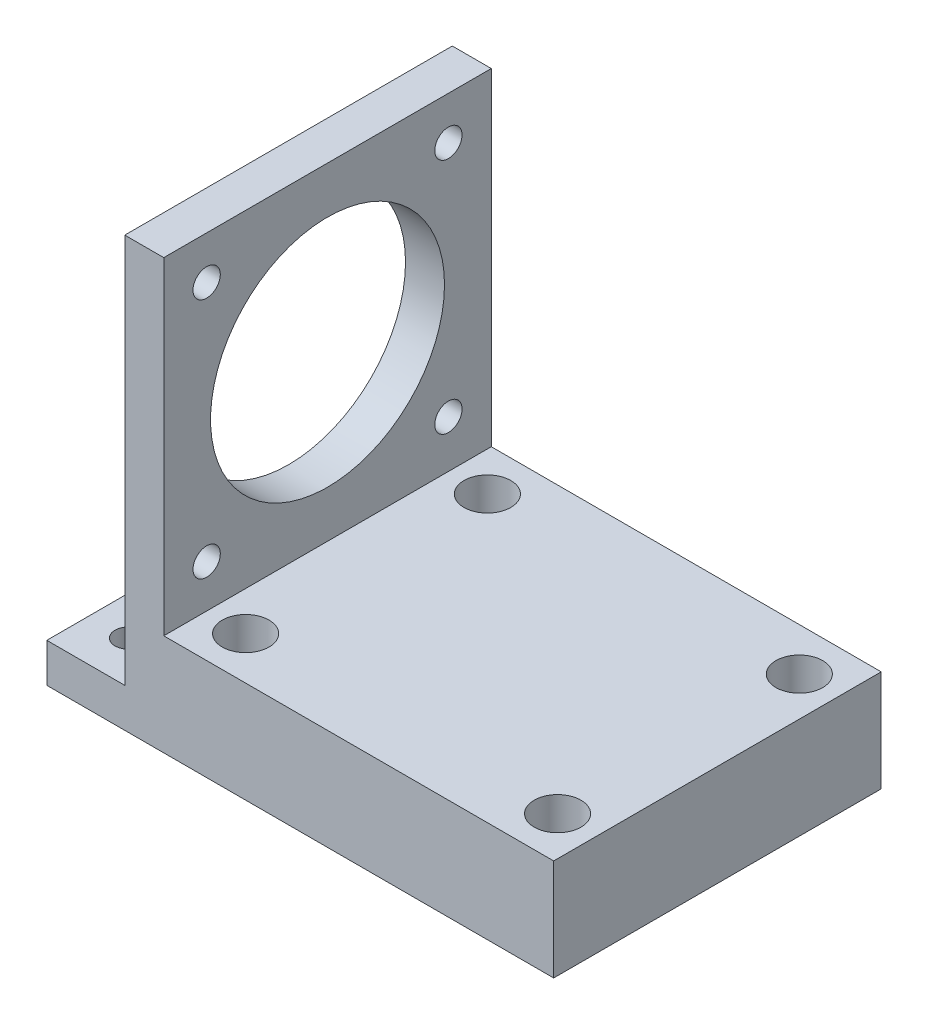
ISO-10303-21;
HEADER;
FILE_DESCRIPTION(('STEP AP214'),'2;1');
FILE_NAME('part.step','',(''),(''),'','','');
FILE_SCHEMA(('AUTOMOTIVE_DESIGN { 1 0 10303 214 1 1 1 1 }'));
ENDSEC;
DATA;
#1=APPLICATION_CONTEXT('core data for automotive mechanical design processes');
#2=APPLICATION_PROTOCOL_DEFINITION('international standard','automotive_design',2000,#1);
#3=PRODUCT_CONTEXT('',#1,'mechanical');
#4=PRODUCT('Part','Part','',(#3));
#5=PRODUCT_RELATED_PRODUCT_CATEGORY('part','',(#4));
#6=PRODUCT_DEFINITION_FORMATION('','',#4);
#7=PRODUCT_DEFINITION_CONTEXT('part definition',#1,'design');
#8=PRODUCT_DEFINITION('design','',#6,#7);
#9=PRODUCT_DEFINITION_SHAPE('','',#8);
#10=(LENGTH_UNIT() NAMED_UNIT(*) SI_UNIT(.MILLI.,.METRE.));
#11=(NAMED_UNIT(*) PLANE_ANGLE_UNIT() SI_UNIT($,.RADIAN.));
#12=(NAMED_UNIT(*) SI_UNIT($,.STERADIAN.) SOLID_ANGLE_UNIT());
#13=UNCERTAINTY_MEASURE_WITH_UNIT(LENGTH_MEASURE(1.E-05),#10,'distance_accuracy_value','');
#14=(GEOMETRIC_REPRESENTATION_CONTEXT(3) GLOBAL_UNCERTAINTY_ASSIGNED_CONTEXT((#13)) GLOBAL_UNIT_ASSIGNED_CONTEXT((#10,
#11,#12)) REPRESENTATION_CONTEXT('',''));
#15=CARTESIAN_POINT('',(0.,0.,0.));
#16=DIRECTION('',(0.,0.,1.));
#17=DIRECTION('',(1.,0.,0.));
#18=AXIS2_PLACEMENT_3D('',#15,#16,#17);
#19=CARTESIAN_POINT('',(-12.5,0.,-15.5));
#20=DIRECTION('',(0.,1.,0.));
#21=DIRECTION('',(0.,0.,1.));
#22=AXIS2_PLACEMENT_3D('',#19,#20,#21);
#23=CYLINDRICAL_SURFACE('',#22,1.75);
#24=CARTESIAN_POINT('',(-12.5,0.,-15.5));
#25=DIRECTION('',(0.,1.,0.));
#26=DIRECTION('',(0.,0.,1.));
#27=AXIS2_PLACEMENT_3D('',#24,#25,#26);
#28=CIRCLE('',#27,1.75);
#29=CARTESIAN_POINT('',(-12.5,0.,-13.75));
#30=VERTEX_POINT('',#29);
#31=EDGE_CURVE('E190',#30,#30,#28,.T.);
#32=ORIENTED_EDGE('',*,*,#31,.F.);
#33=EDGE_LOOP('',(#32));
#34=FACE_BOUND('',#33,.T.);
#35=CARTESIAN_POINT('',(-12.5,5.,-15.5));
#36=DIRECTION('',(0.,1.,0.));
#37=DIRECTION('',(0.,0.,1.));
#38=AXIS2_PLACEMENT_3D('',#35,#36,#37);
#39=CIRCLE('',#38,1.75);
#40=CARTESIAN_POINT('',(-12.5,5.,-13.75));
#41=VERTEX_POINT('',#40);
#42=EDGE_CURVE('E42',#41,#41,#39,.F.);
#43=ORIENTED_EDGE('',*,*,#42,.F.);
#44=EDGE_LOOP('',(#43));
#45=FACE_BOUND('',#44,.T.);
#46=ADVANCED_FACE('F38',(#34,#45),#23,.F.);
#47=CARTESIAN_POINT('',(27.5,0.,-15.5));
#48=DIRECTION('',(0.,1.,0.));
#49=DIRECTION('',(0.,0.,1.));
#50=AXIS2_PLACEMENT_3D('',#47,#48,#49);
#51=CYLINDRICAL_SURFACE('',#50,1.75);
#52=CARTESIAN_POINT('',(27.5,0.,-15.5));
#53=DIRECTION('',(0.,1.,0.));
#54=DIRECTION('',(0.,0.,1.));
#55=AXIS2_PLACEMENT_3D('',#52,#53,#54);
#56=CIRCLE('',#55,1.75);
#57=CARTESIAN_POINT('',(27.5,0.,-13.75));
#58=VERTEX_POINT('',#57);
#59=EDGE_CURVE('E186',#58,#58,#56,.T.);
#60=ORIENTED_EDGE('',*,*,#59,.F.);
#61=EDGE_LOOP('',(#60));
#62=FACE_BOUND('',#61,.T.);
#63=CARTESIAN_POINT('',(27.5,5.,-15.5));
#64=DIRECTION('',(0.,1.,0.));
#65=DIRECTION('',(0.,0.,1.));
#66=AXIS2_PLACEMENT_3D('',#63,#64,#65);
#67=CIRCLE('',#66,1.75);
#68=CARTESIAN_POINT('',(27.5,5.,-13.75));
#69=VERTEX_POINT('',#68);
#70=EDGE_CURVE('E168',#69,#69,#67,.F.);
#71=ORIENTED_EDGE('',*,*,#70,.F.);
#72=EDGE_LOOP('',(#71));
#73=FACE_BOUND('',#72,.T.);
#74=ADVANCED_FACE('F303',(#62,#73),#51,.F.);
#75=CARTESIAN_POINT('',(27.5000000000003,0.,15.5));
#76=DIRECTION('',(0.,1.,0.));
#77=DIRECTION('',(0.,0.,1.));
#78=AXIS2_PLACEMENT_3D('',#75,#76,#77);
#79=CYLINDRICAL_SURFACE('',#78,1.75);
#80=CARTESIAN_POINT('',(27.5000000000003,0.,15.5));
#81=DIRECTION('',(0.,1.,0.));
#82=DIRECTION('',(0.,0.,1.));
#83=AXIS2_PLACEMENT_3D('',#80,#81,#82);
#84=CIRCLE('',#83,1.75);
#85=CARTESIAN_POINT('',(27.5000000000003,0.,17.25));
#86=VERTEX_POINT('',#85);
#87=EDGE_CURVE('E180',#86,#86,#84,.T.);
#88=ORIENTED_EDGE('',*,*,#87,.F.);
#89=EDGE_LOOP('',(#88));
#90=FACE_BOUND('',#89,.T.);
#91=CARTESIAN_POINT('',(27.5000000000003,5.,15.5));
#92=DIRECTION('',(0.,1.,0.));
#93=DIRECTION('',(0.,0.,1.));
#94=AXIS2_PLACEMENT_3D('',#91,#92,#93);
#95=CIRCLE('',#94,1.75);
#96=CARTESIAN_POINT('',(27.5000000000003,5.,17.25));
#97=VERTEX_POINT('',#96);
#98=EDGE_CURVE('E164',#97,#97,#95,.F.);
#99=ORIENTED_EDGE('',*,*,#98,.F.);
#100=EDGE_LOOP('',(#99));
#101=FACE_BOUND('',#100,.T.);
#102=ADVANCED_FACE('F310',(#90,#101),#79,.F.);
#103=CARTESIAN_POINT('',(-12.4999999999997,0.,15.5));
#104=DIRECTION('',(0.,1.,0.));
#105=DIRECTION('',(0.,0.,1.));
#106=AXIS2_PLACEMENT_3D('',#103,#104,#105);
#107=CYLINDRICAL_SURFACE('',#106,1.75);
#108=CARTESIAN_POINT('',(-12.4999999999997,0.,15.5));
#109=DIRECTION('',(0.,1.,0.));
#110=DIRECTION('',(0.,0.,1.));
#111=AXIS2_PLACEMENT_3D('',#108,#109,#110);
#112=CIRCLE('',#111,1.75);
#113=CARTESIAN_POINT('',(-12.4999999999997,0.,17.25));
#114=VERTEX_POINT('',#113);
#115=EDGE_CURVE('E175',#114,#114,#112,.T.);
#116=ORIENTED_EDGE('',*,*,#115,.F.);
#117=EDGE_LOOP('',(#116));
#118=FACE_BOUND('',#117,.T.);
#119=CARTESIAN_POINT('',(-12.4999999999997,5.,15.5));
#120=DIRECTION('',(0.,1.,0.));
#121=DIRECTION('',(0.,0.,1.));
#122=AXIS2_PLACEMENT_3D('',#119,#120,#121);
#123=CIRCLE('',#122,1.75);
#124=CARTESIAN_POINT('',(-12.4999999999997,5.,17.25));
#125=VERTEX_POINT('',#124);
#126=EDGE_CURVE('E160',#125,#125,#123,.F.);
#127=ORIENTED_EDGE('',*,*,#126,.F.);
#128=EDGE_LOOP('',(#127));
#129=FACE_BOUND('',#128,.T.);
#130=ADVANCED_FACE('F317',(#118,#129),#107,.F.);
#131=CARTESIAN_POINT('',(0.,55.,0.));
#132=DIRECTION('',(0.,-1.,0.));
#133=DIRECTION('',(0.,0.,-1.));
#134=AXIS2_PLACEMENT_3D('',#131,#132,#133);
#135=PLANE('',#134);
#136=DIRECTION('',(0.,0.,1.));
#137=VECTOR('',#136,1.);
#138=CARTESIAN_POINT('',(-17.5,55.,21.));
#139=LINE('',#138,#137);
#140=CARTESIAN_POINT('',(-17.5,55.,-21.));
#141=VERTEX_POINT('',#140);
#142=CARTESIAN_POINT('',(-17.5,55.,21.));
#143=VERTEX_POINT('',#142);
#144=EDGE_CURVE('E108',#141,#143,#139,.T.);
#145=ORIENTED_EDGE('',*,*,#144,.F.);
#146=DIRECTION('',(-1.,0.,0.));
#147=VECTOR('',#146,1.);
#148=CARTESIAN_POINT('',(32.5,55.,-21.));
#149=LINE('',#148,#147);
#150=CARTESIAN_POINT('',(-22.5,55.,-21.));
#151=VERTEX_POINT('',#150);
#152=EDGE_CURVE('E119',#141,#151,#149,.T.);
#153=ORIENTED_EDGE('',*,*,#152,.T.);
#154=DIRECTION('',(0.,0.,-1.));
#155=VECTOR('',#154,1.);
#156=CARTESIAN_POINT('',(-22.5,55.,-21.));
#157=LINE('',#156,#155);
#158=CARTESIAN_POINT('',(-22.5,55.,21.));
#159=VERTEX_POINT('',#158);
#160=EDGE_CURVE('E257',#159,#151,#157,.T.);
#161=ORIENTED_EDGE('',*,*,#160,.F.);
#162=DIRECTION('',(1.,0.,0.));
#163=VECTOR('',#162,1.);
#164=CARTESIAN_POINT('',(32.5,55.,21.));
#165=LINE('',#164,#163);
#166=EDGE_CURVE('E121',#159,#143,#165,.T.);
#167=ORIENTED_EDGE('',*,*,#166,.T.);
#168=EDGE_LOOP('',(#145,#153,#161,#167));
#169=FACE_BOUND('',#168,.T.);
#170=ADVANCED_FACE('F118',(#169),#135,.F.);
#171=CARTESIAN_POINT('',(-32.5,55.,-21.));
#172=DIRECTION('',(1.,0.,0.));
#173=DIRECTION('',(0.,0.,-1.));
#174=AXIS2_PLACEMENT_3D('',#171,#172,#173);
#175=PLANE('',#174);
#176=DIRECTION('',(0.,-1.,0.));
#177=VECTOR('',#176,1.);
#178=CARTESIAN_POINT('',(-32.5,55.,21.));
#179=LINE('',#178,#177);
#180=CARTESIAN_POINT('',(-32.5,5.,21.));
#181=VERTEX_POINT('',#180);
#182=CARTESIAN_POINT('',(-32.5,0.,21.));
#183=VERTEX_POINT('',#182);
#184=EDGE_CURVE('E11',#181,#183,#179,.T.);
#185=ORIENTED_EDGE('',*,*,#184,.F.);
#186=DIRECTION('',(0.,0.,1.));
#187=VECTOR('',#186,1.);
#188=CARTESIAN_POINT('',(-32.5,5.,-21.));
#189=LINE('',#188,#187);
#190=CARTESIAN_POINT('',(-32.5,5.,-21.));
#191=VERTEX_POINT('',#190);
#192=EDGE_CURVE('E252',#191,#181,#189,.T.);
#193=ORIENTED_EDGE('',*,*,#192,.F.);
#194=DIRECTION('',(0.,-1.,0.));
#195=VECTOR('',#194,1.);
#196=CARTESIAN_POINT('',(-32.5,55.,-21.));
#197=LINE('',#196,#195);
#198=CARTESIAN_POINT('',(-32.5,0.,-21.));
#199=VERTEX_POINT('',#198);
#200=EDGE_CURVE('E130',#191,#199,#197,.T.);
#201=ORIENTED_EDGE('',*,*,#200,.T.);
#202=DIRECTION('',(0.,0.,1.));
#203=VECTOR('',#202,1.);
#204=CARTESIAN_POINT('',(-32.5,0.,-21.));
#205=LINE('',#204,#203);
#206=EDGE_CURVE('E140',#199,#183,#205,.T.);
#207=ORIENTED_EDGE('',*,*,#206,.T.);
#208=EDGE_LOOP('',(#185,#193,#201,#207));
#209=FACE_BOUND('',#208,.T.);
#210=ADVANCED_FACE('F40',(#209),#175,.F.);
#211=CARTESIAN_POINT('',(32.5,55.,21.));
#212=DIRECTION('',(0.,0.,-1.));
#213=DIRECTION('',(-1.,0.,0.));
#214=AXIS2_PLACEMENT_3D('',#211,#212,#213);
#215=PLANE('',#214);
#216=DIRECTION('',(0.,-1.,0.));
#217=VECTOR('',#216,1.);
#218=CARTESIAN_POINT('',(32.5,55.,21.));
#219=LINE('',#218,#217);
#220=CARTESIAN_POINT('',(32.5,13.,21.));
#221=VERTEX_POINT('',#220);
#222=CARTESIAN_POINT('',(32.5,0.,21.));
#223=VERTEX_POINT('',#222);
#224=EDGE_CURVE('E48',#221,#223,#219,.T.);
#225=ORIENTED_EDGE('',*,*,#224,.F.);
#226=DIRECTION('',(1.,0.,0.));
#227=VECTOR('',#226,1.);
#228=CARTESIAN_POINT('',(-17.5,13.,21.));
#229=LINE('',#228,#227);
#230=CARTESIAN_POINT('',(-17.5,13.,21.));
#231=VERTEX_POINT('',#230);
#232=EDGE_CURVE('E246',#231,#221,#229,.T.);
#233=ORIENTED_EDGE('',*,*,#232,.F.);
#234=DIRECTION('',(0.,-1.,0.));
#235=VECTOR('',#234,1.);
#236=CARTESIAN_POINT('',(-17.5,55.,21.));
#237=LINE('',#236,#235);
#238=EDGE_CURVE('E123',#143,#231,#237,.T.);
#239=ORIENTED_EDGE('',*,*,#238,.F.);
#240=ORIENTED_EDGE('',*,*,#166,.F.);
#241=DIRECTION('',(0.,1.,0.));
#242=VECTOR('',#241,1.);
#243=CARTESIAN_POINT('',(-22.5,55.,21.));
#244=LINE('',#243,#242);
#245=CARTESIAN_POINT('',(-22.5,5.,21.));
#246=VERTEX_POINT('',#245);
#247=EDGE_CURVE('E64',#246,#159,#244,.T.);
#248=ORIENTED_EDGE('',*,*,#247,.F.);
#249=DIRECTION('',(-1.,0.,0.));
#250=VECTOR('',#249,1.);
#251=CARTESIAN_POINT('',(-22.5,5.,21.));
#252=LINE('',#251,#250);
#253=EDGE_CURVE('E145',#246,#181,#252,.T.);
#254=ORIENTED_EDGE('',*,*,#253,.T.);
#255=ORIENTED_EDGE('',*,*,#184,.T.);
#256=DIRECTION('',(1.,0.,0.));
#257=VECTOR('',#256,1.);
#258=CARTESIAN_POINT('',(32.5,0.,21.));
#259=LINE('',#258,#257);
#260=EDGE_CURVE('E144',#183,#223,#259,.T.);
#261=ORIENTED_EDGE('',*,*,#260,.T.);
#262=EDGE_LOOP('',(#225,#233,#239,#240,#248,#254,#255,#261));
#263=FACE_BOUND('',#262,.T.);
#264=ADVANCED_FACE('F287',(#263),#215,.F.);
#265=CARTESIAN_POINT('',(32.5,55.,-21.));
#266=DIRECTION('',(-1.,0.,0.));
#267=DIRECTION('',(0.,0.,1.));
#268=AXIS2_PLACEMENT_3D('',#265,#266,#267);
#269=PLANE('',#268);
#270=DIRECTION('',(0.,-1.,0.));
#271=VECTOR('',#270,1.);
#272=CARTESIAN_POINT('',(32.5,55.,-21.));
#273=LINE('',#272,#271);
#274=CARTESIAN_POINT('',(32.5,13.,-21.));
#275=VERTEX_POINT('',#274);
#276=CARTESIAN_POINT('',(32.5,0.,-21.));
#277=VERTEX_POINT('',#276);
#278=EDGE_CURVE('E134',#275,#277,#273,.T.);
#279=ORIENTED_EDGE('',*,*,#278,.F.);
#280=DIRECTION('',(0.,0.,-1.));
#281=VECTOR('',#280,1.);
#282=CARTESIAN_POINT('',(32.5,13.,21.));
#283=LINE('',#282,#281);
#284=EDGE_CURVE('E114',#221,#275,#283,.T.);
#285=ORIENTED_EDGE('',*,*,#284,.F.);
#286=ORIENTED_EDGE('',*,*,#224,.T.);
#287=DIRECTION('',(0.,0.,-1.));
#288=VECTOR('',#287,1.);
#289=CARTESIAN_POINT('',(32.5,0.,-21.));
#290=LINE('',#289,#288);
#291=EDGE_CURVE('E149',#223,#277,#290,.T.);
#292=ORIENTED_EDGE('',*,*,#291,.T.);
#293=EDGE_LOOP('',(#279,#285,#286,#292));
#294=FACE_BOUND('',#293,.T.);
#295=ADVANCED_FACE('F294',(#294),#269,.F.);
#296=CARTESIAN_POINT('',(32.5,55.,-21.));
#297=DIRECTION('',(0.,0.,1.));
#298=DIRECTION('',(1.,0.,0.));
#299=AXIS2_PLACEMENT_3D('',#296,#297,#298);
#300=PLANE('',#299);
#301=DIRECTION('',(0.,1.,0.));
#302=VECTOR('',#301,1.);
#303=CARTESIAN_POINT('',(-17.5,55.,-21.));
#304=LINE('',#303,#302);
#305=CARTESIAN_POINT('',(-17.5,13.,-21.));
#306=VERTEX_POINT('',#305);
#307=EDGE_CURVE('E105',#306,#141,#304,.T.);
#308=ORIENTED_EDGE('',*,*,#307,.F.);
#309=DIRECTION('',(1.,0.,0.));
#310=VECTOR('',#309,1.);
#311=CARTESIAN_POINT('',(-17.5,13.,-21.));
#312=LINE('',#311,#310);
#313=EDGE_CURVE('E249',#306,#275,#312,.T.);
#314=ORIENTED_EDGE('',*,*,#313,.T.);
#315=ORIENTED_EDGE('',*,*,#278,.T.);
#316=DIRECTION('',(-1.,0.,0.));
#317=VECTOR('',#316,1.);
#318=CARTESIAN_POINT('',(32.5,0.,-21.));
#319=LINE('',#318,#317);
#320=EDGE_CURVE('E136',#277,#199,#319,.T.);
#321=ORIENTED_EDGE('',*,*,#320,.T.);
#322=ORIENTED_EDGE('',*,*,#200,.F.);
#323=DIRECTION('',(-1.,0.,0.));
#324=VECTOR('',#323,1.);
#325=CARTESIAN_POINT('',(-22.5,5.,-21.));
#326=LINE('',#325,#324);
#327=CARTESIAN_POINT('',(-22.5,5.,-21.));
#328=VERTEX_POINT('',#327);
#329=EDGE_CURVE('E265',#328,#191,#326,.T.);
#330=ORIENTED_EDGE('',*,*,#329,.F.);
#331=DIRECTION('',(0.,-1.,0.));
#332=VECTOR('',#331,1.);
#333=CARTESIAN_POINT('',(-22.5,55.,-21.));
#334=LINE('',#333,#332);
#335=EDGE_CURVE('E128',#151,#328,#334,.T.);
#336=ORIENTED_EDGE('',*,*,#335,.F.);
#337=ORIENTED_EDGE('',*,*,#152,.F.);
#338=EDGE_LOOP('',(#308,#314,#315,#321,#322,#330,#336,#337));
#339=FACE_BOUND('',#338,.T.);
#340=ADVANCED_FACE('F126',(#339),#300,.F.);
#341=CARTESIAN_POINT('',(0.,0.,0.));
#342=DIRECTION('',(0.,-1.,0.));
#343=DIRECTION('',(0.,0.,-1.));
#344=AXIS2_PLACEMENT_3D('',#341,#342,#343);
#345=PLANE('',#344);
#346=ORIENTED_EDGE('',*,*,#115,.T.);
#347=EDGE_LOOP('',(#346));
#348=FACE_BOUND('',#347,.T.);
#349=ORIENTED_EDGE('',*,*,#87,.T.);
#350=EDGE_LOOP('',(#349));
#351=FACE_BOUND('',#350,.T.);
#352=ORIENTED_EDGE('',*,*,#59,.T.);
#353=EDGE_LOOP('',(#352));
#354=FACE_BOUND('',#353,.T.);
#355=ORIENTED_EDGE('',*,*,#31,.T.);
#356=EDGE_LOOP('',(#355));
#357=FACE_BOUND('',#356,.T.);
#358=CARTESIAN_POINT('',(-27.5,0.,-15.5));
#359=DIRECTION('',(0.,1.,0.));
#360=DIRECTION('',(0.,0.,1.));
#361=AXIS2_PLACEMENT_3D('',#358,#359,#360);
#362=CIRCLE('',#361,1.75);
#363=CARTESIAN_POINT('',(-27.5,0.,-13.75));
#364=VERTEX_POINT('',#363);
#365=EDGE_CURVE('E195',#364,#364,#362,.T.);
#366=ORIENTED_EDGE('',*,*,#365,.T.);
#367=EDGE_LOOP('',(#366));
#368=FACE_BOUND('',#367,.T.);
#369=CARTESIAN_POINT('',(-27.5,0.,15.5));
#370=DIRECTION('',(0.,1.,0.));
#371=DIRECTION('',(0.,0.,1.));
#372=AXIS2_PLACEMENT_3D('',#369,#370,#371);
#373=CIRCLE('',#372,1.75);
#374=CARTESIAN_POINT('',(-27.5,0.,17.25));
#375=VERTEX_POINT('',#374);
#376=EDGE_CURVE('E204',#375,#375,#373,.T.);
#377=ORIENTED_EDGE('',*,*,#376,.T.);
#378=EDGE_LOOP('',(#377));
#379=FACE_BOUND('',#378,.T.);
#380=ORIENTED_EDGE('',*,*,#206,.F.);
#381=ORIENTED_EDGE('',*,*,#320,.F.);
#382=ORIENTED_EDGE('',*,*,#291,.F.);
#383=ORIENTED_EDGE('',*,*,#260,.F.);
#384=EDGE_LOOP('',(#380,#381,#382,#383));
#385=FACE_BOUND('',#384,.T.);
#386=ADVANCED_FACE('F284',(#348,#351,#354,#357,#368,#379,#385),#345,.T.);
#387=CARTESIAN_POINT('',(-22.5,5.,-21.));
#388=DIRECTION('',(0.,-1.,0.));
#389=DIRECTION('',(0.,0.,-1.));
#390=AXIS2_PLACEMENT_3D('',#387,#388,#389);
#391=PLANE('',#390);
#392=CARTESIAN_POINT('',(-27.5,5.,-15.5));
#393=DIRECTION('',(0.,1.,0.));
#394=DIRECTION('',(0.,0.,1.));
#395=AXIS2_PLACEMENT_3D('',#392,#393,#394);
#396=CIRCLE('',#395,1.75);
#397=CARTESIAN_POINT('',(-27.5,5.,-13.75));
#398=VERTEX_POINT('',#397);
#399=EDGE_CURVE('E200',#398,#398,#396,.T.);
#400=ORIENTED_EDGE('',*,*,#399,.F.);
#401=EDGE_LOOP('',(#400));
#402=FACE_BOUND('',#401,.T.);
#403=CARTESIAN_POINT('',(-27.5,5.,15.5));
#404=DIRECTION('',(0.,1.,0.));
#405=DIRECTION('',(0.,0.,1.));
#406=AXIS2_PLACEMENT_3D('',#403,#404,#405);
#407=CIRCLE('',#406,1.75);
#408=CARTESIAN_POINT('',(-27.5,5.,17.25));
#409=VERTEX_POINT('',#408);
#410=EDGE_CURVE('E194',#409,#409,#407,.T.);
#411=ORIENTED_EDGE('',*,*,#410,.F.);
#412=EDGE_LOOP('',(#411));
#413=FACE_BOUND('',#412,.T.);
#414=ORIENTED_EDGE('',*,*,#192,.T.);
#415=ORIENTED_EDGE('',*,*,#253,.F.);
#416=DIRECTION('',(0.,0.,1.));
#417=VECTOR('',#416,1.);
#418=CARTESIAN_POINT('',(-22.5,5.,-21.));
#419=LINE('',#418,#417);
#420=EDGE_CURVE('E262',#328,#246,#419,.T.);
#421=ORIENTED_EDGE('',*,*,#420,.F.);
#422=ORIENTED_EDGE('',*,*,#329,.T.);
#423=EDGE_LOOP('',(#414,#415,#421,#422));
#424=FACE_BOUND('',#423,.T.);
#425=ADVANCED_FACE('F274',(#402,#413,#424),#391,.F.);
#426=CARTESIAN_POINT('',(-22.5,0.,0.));
#427=DIRECTION('',(-1.,0.,0.));
#428=DIRECTION('',(0.,0.,1.));
#429=AXIS2_PLACEMENT_3D('',#426,#427,#428);
#430=PLANE('',#429);
#431=CARTESIAN_POINT('',(-22.5,34.,0.));
#432=DIRECTION('',(-1.,0.,0.));
#433=DIRECTION('',(0.,0.,1.));
#434=AXIS2_PLACEMENT_3D('',#431,#432,#433);
#435=CIRCLE('',#434,15.);
#436=CARTESIAN_POINT('',(-22.5,34.,15.));
#437=VERTEX_POINT('',#436);
#438=EDGE_CURVE('E392',#437,#437,#435,.T.);
#439=ORIENTED_EDGE('',*,*,#438,.F.);
#440=EDGE_LOOP('',(#439));
#441=FACE_BOUND('',#440,.T.);
#442=CARTESIAN_POINT('',(-22.5,18.5,15.5));
#443=DIRECTION('',(-1.,0.,0.));
#444=DIRECTION('',(0.,0.,1.));
#445=AXIS2_PLACEMENT_3D('',#442,#443,#444);
#446=CIRCLE('',#445,1.75);
#447=CARTESIAN_POINT('',(-22.5,18.5,17.25));
#448=VERTEX_POINT('',#447);
#449=EDGE_CURVE('E238',#448,#448,#446,.T.);
#450=ORIENTED_EDGE('',*,*,#449,.F.);
#451=EDGE_LOOP('',(#450));
#452=FACE_BOUND('',#451,.T.);
#453=CARTESIAN_POINT('',(-22.5,19.0706640665856,-15.5));
#454=DIRECTION('',(-1.,0.,0.));
#455=DIRECTION('',(0.,0.,1.));
#456=AXIS2_PLACEMENT_3D('',#453,#454,#455);
#457=CIRCLE('',#456,1.75);
#458=CARTESIAN_POINT('',(-22.5,19.0706640665856,-13.75));
#459=VERTEX_POINT('',#458);
#460=EDGE_CURVE('E234',#459,#459,#457,.T.);
#461=ORIENTED_EDGE('',*,*,#460,.F.);
#462=EDGE_LOOP('',(#461));
#463=FACE_BOUND('',#462,.T.);
#464=CARTESIAN_POINT('',(-22.5,49.5,-15.5));
#465=DIRECTION('',(-1.,0.,0.));
#466=DIRECTION('',(0.,0.,1.));
#467=AXIS2_PLACEMENT_3D('',#464,#465,#466);
#468=CIRCLE('',#467,1.75);
#469=CARTESIAN_POINT('',(-22.5,49.5,-13.75));
#470=VERTEX_POINT('',#469);
#471=EDGE_CURVE('E230',#470,#470,#468,.T.);
#472=ORIENTED_EDGE('',*,*,#471,.F.);
#473=EDGE_LOOP('',(#472));
#474=FACE_BOUND('',#473,.T.);
#475=CARTESIAN_POINT('',(-22.5,49.5,15.5));
#476=DIRECTION('',(-1.,0.,0.));
#477=DIRECTION('',(0.,0.,1.));
#478=AXIS2_PLACEMENT_3D('',#475,#476,#477);
#479=CIRCLE('',#478,1.75);
#480=CARTESIAN_POINT('',(-22.5,49.5,17.25));
#481=VERTEX_POINT('',#480);
#482=EDGE_CURVE('E226',#481,#481,#479,.T.);
#483=ORIENTED_EDGE('',*,*,#482,.F.);
#484=EDGE_LOOP('',(#483));
#485=FACE_BOUND('',#484,.T.);
#486=ORIENTED_EDGE('',*,*,#247,.T.);
#487=ORIENTED_EDGE('',*,*,#160,.T.);
#488=ORIENTED_EDGE('',*,*,#335,.T.);
#489=ORIENTED_EDGE('',*,*,#420,.T.);
#490=EDGE_LOOP('',(#486,#487,#488,#489));
#491=FACE_BOUND('',#490,.T.);
#492=ADVANCED_FACE('F289',(#441,#452,#463,#474,#485,#491),#430,.T.);
#493=CARTESIAN_POINT('',(-17.5,13.,21.));
#494=DIRECTION('',(0.,-1.,0.));
#495=DIRECTION('',(0.,0.,-1.));
#496=AXIS2_PLACEMENT_3D('',#493,#494,#495);
#497=PLANE('',#496);
#498=CARTESIAN_POINT('',(-12.4999999999997,13.,15.5));
#499=DIRECTION('',(0.,1.,0.));
#500=DIRECTION('',(0.,0.,1.));
#501=AXIS2_PLACEMENT_3D('',#498,#499,#500);
#502=CIRCLE('',#501,3.);
#503=CARTESIAN_POINT('',(-12.4999999999997,13.,18.5));
#504=VERTEX_POINT('',#503);
#505=EDGE_CURVE('E387',#504,#504,#502,.T.);
#506=ORIENTED_EDGE('',*,*,#505,.F.);
#507=EDGE_LOOP('',(#506));
#508=FACE_BOUND('',#507,.T.);
#509=CARTESIAN_POINT('',(27.5000000000003,13.,15.5));
#510=DIRECTION('',(0.,1.,0.));
#511=DIRECTION('',(0.,0.,1.));
#512=AXIS2_PLACEMENT_3D('',#509,#510,#511);
#513=CIRCLE('',#512,3.);
#514=CARTESIAN_POINT('',(27.5000000000003,13.,18.5));
#515=VERTEX_POINT('',#514);
#516=EDGE_CURVE('E396',#515,#515,#513,.T.);
#517=ORIENTED_EDGE('',*,*,#516,.F.);
#518=EDGE_LOOP('',(#517));
#519=FACE_BOUND('',#518,.T.);
#520=CARTESIAN_POINT('',(27.5,13.,-15.5));
#521=DIRECTION('',(0.,1.,0.));
#522=DIRECTION('',(0.,0.,1.));
#523=AXIS2_PLACEMENT_3D('',#520,#521,#522);
#524=CIRCLE('',#523,3.);
#525=CARTESIAN_POINT('',(27.5,13.,-12.5));
#526=VERTEX_POINT('',#525);
#527=EDGE_CURVE('E404',#526,#526,#524,.T.);
#528=ORIENTED_EDGE('',*,*,#527,.F.);
#529=EDGE_LOOP('',(#528));
#530=FACE_BOUND('',#529,.T.);
#531=CARTESIAN_POINT('',(-12.5,13.,-15.5));
#532=DIRECTION('',(0.,1.,0.));
#533=DIRECTION('',(0.,0.,1.));
#534=AXIS2_PLACEMENT_3D('',#531,#532,#533);
#535=CIRCLE('',#534,3.);
#536=CARTESIAN_POINT('',(-12.5,13.,-12.5));
#537=VERTEX_POINT('',#536);
#538=EDGE_CURVE('E379',#537,#537,#535,.T.);
#539=ORIENTED_EDGE('',*,*,#538,.F.);
#540=EDGE_LOOP('',(#539));
#541=FACE_BOUND('',#540,.T.);
#542=ORIENTED_EDGE('',*,*,#284,.T.);
#543=ORIENTED_EDGE('',*,*,#313,.F.);
#544=DIRECTION('',(0.,0.,-1.));
#545=VECTOR('',#544,1.);
#546=CARTESIAN_POINT('',(-17.5,13.,21.));
#547=LINE('',#546,#545);
#548=EDGE_CURVE('E56',#231,#306,#547,.T.);
#549=ORIENTED_EDGE('',*,*,#548,.F.);
#550=ORIENTED_EDGE('',*,*,#232,.T.);
#551=EDGE_LOOP('',(#542,#543,#549,#550));
#552=FACE_BOUND('',#551,.T.);
#553=ADVANCED_FACE('F291',(#508,#519,#530,#541,#552),#497,.F.);
#554=CARTESIAN_POINT('',(-17.5,0.,0.));
#555=DIRECTION('',(1.,0.,0.));
#556=DIRECTION('',(0.,0.,-1.));
#557=AXIS2_PLACEMENT_3D('',#554,#555,#556);
#558=PLANE('',#557);
#559=CARTESIAN_POINT('',(-17.5,34.,0.));
#560=DIRECTION('',(1.,0.,0.));
#561=DIRECTION('',(0.,0.,-1.));
#562=AXIS2_PLACEMENT_3D('',#559,#560,#561);
#563=CIRCLE('',#562,15.);
#564=CARTESIAN_POINT('',(-17.5,34.,-15.));
#565=VERTEX_POINT('',#564);
#566=EDGE_CURVE('E414',#565,#565,#563,.T.);
#567=ORIENTED_EDGE('',*,*,#566,.F.);
#568=EDGE_LOOP('',(#567));
#569=FACE_BOUND('',#568,.T.);
#570=CARTESIAN_POINT('',(-17.5,18.5,15.5));
#571=DIRECTION('',(1.,0.,0.));
#572=DIRECTION('',(0.,0.,-1.));
#573=AXIS2_PLACEMENT_3D('',#570,#571,#572);
#574=CIRCLE('',#573,1.75);
#575=CARTESIAN_POINT('',(-17.5,18.5,13.75));
#576=VERTEX_POINT('',#575);
#577=EDGE_CURVE('E199',#576,#576,#574,.T.);
#578=ORIENTED_EDGE('',*,*,#577,.F.);
#579=EDGE_LOOP('',(#578));
#580=FACE_BOUND('',#579,.T.);
#581=CARTESIAN_POINT('',(-17.5,19.0706640665856,-15.5));
#582=DIRECTION('',(1.,0.,0.));
#583=DIRECTION('',(0.,0.,-1.));
#584=AXIS2_PLACEMENT_3D('',#581,#582,#583);
#585=CIRCLE('',#584,1.75);
#586=CARTESIAN_POINT('',(-17.5,19.0706640665856,-17.25));
#587=VERTEX_POINT('',#586);
#588=EDGE_CURVE('E216',#587,#587,#585,.T.);
#589=ORIENTED_EDGE('',*,*,#588,.F.);
#590=EDGE_LOOP('',(#589));
#591=FACE_BOUND('',#590,.T.);
#592=CARTESIAN_POINT('',(-17.5,49.5,-15.5));
#593=DIRECTION('',(1.,0.,0.));
#594=DIRECTION('',(0.,0.,-1.));
#595=AXIS2_PLACEMENT_3D('',#592,#593,#594);
#596=CIRCLE('',#595,1.75);
#597=CARTESIAN_POINT('',(-17.5,49.5,-17.25));
#598=VERTEX_POINT('',#597);
#599=EDGE_CURVE('E211',#598,#598,#596,.T.);
#600=ORIENTED_EDGE('',*,*,#599,.F.);
#601=EDGE_LOOP('',(#600));
#602=FACE_BOUND('',#601,.T.);
#603=CARTESIAN_POINT('',(-17.5,49.5,15.5));
#604=DIRECTION('',(1.,0.,0.));
#605=DIRECTION('',(0.,0.,-1.));
#606=AXIS2_PLACEMENT_3D('',#603,#604,#605);
#607=CIRCLE('',#606,1.75);
#608=CARTESIAN_POINT('',(-17.5,49.5,13.75));
#609=VERTEX_POINT('',#608);
#610=EDGE_CURVE('E215',#609,#609,#607,.T.);
#611=ORIENTED_EDGE('',*,*,#610,.F.);
#612=EDGE_LOOP('',(#611));
#613=FACE_BOUND('',#612,.T.);
#614=ORIENTED_EDGE('',*,*,#307,.T.);
#615=ORIENTED_EDGE('',*,*,#144,.T.);
#616=ORIENTED_EDGE('',*,*,#238,.T.);
#617=ORIENTED_EDGE('',*,*,#548,.T.);
#618=EDGE_LOOP('',(#614,#615,#616,#617));
#619=FACE_BOUND('',#618,.T.);
#620=ADVANCED_FACE('F107',(#569,#580,#591,#602,#613,#619),#558,.T.);
#621=CARTESIAN_POINT('',(-32.5,49.5,15.5));
#622=DIRECTION('',(1.,0.,0.));
#623=DIRECTION('',(0.,0.,-1.));
#624=AXIS2_PLACEMENT_3D('',#621,#622,#623);
#625=CYLINDRICAL_SURFACE('',#624,1.75);
#626=ORIENTED_EDGE('',*,*,#482,.T.);
#627=EDGE_LOOP('',(#626));
#628=FACE_BOUND('',#627,.T.);
#629=ORIENTED_EDGE('',*,*,#610,.T.);
#630=EDGE_LOOP('',(#629));
#631=FACE_BOUND('',#630,.T.);
#632=ADVANCED_FACE('F333',(#628,#631),#625,.F.);
#633=CARTESIAN_POINT('',(-32.5,49.5,-15.5));
#634=DIRECTION('',(1.,0.,0.));
#635=DIRECTION('',(0.,0.,-1.));
#636=AXIS2_PLACEMENT_3D('',#633,#634,#635);
#637=CYLINDRICAL_SURFACE('',#636,1.75);
#638=ORIENTED_EDGE('',*,*,#471,.T.);
#639=EDGE_LOOP('',(#638));
#640=FACE_BOUND('',#639,.T.);
#641=ORIENTED_EDGE('',*,*,#599,.T.);
#642=EDGE_LOOP('',(#641));
#643=FACE_BOUND('',#642,.T.);
#644=ADVANCED_FACE('F329',(#640,#643),#637,.F.);
#645=CARTESIAN_POINT('',(-32.5,19.0706640665856,-15.5));
#646=DIRECTION('',(1.,0.,0.));
#647=DIRECTION('',(0.,0.,-1.));
#648=AXIS2_PLACEMENT_3D('',#645,#646,#647);
#649=CYLINDRICAL_SURFACE('',#648,1.75);
#650=ORIENTED_EDGE('',*,*,#460,.T.);
#651=EDGE_LOOP('',(#650));
#652=FACE_BOUND('',#651,.T.);
#653=ORIENTED_EDGE('',*,*,#588,.T.);
#654=EDGE_LOOP('',(#653));
#655=FACE_BOUND('',#654,.T.);
#656=ADVANCED_FACE('F332',(#652,#655),#649,.F.);
#657=CARTESIAN_POINT('',(-32.5,18.5,15.5));
#658=DIRECTION('',(1.,0.,0.));
#659=DIRECTION('',(0.,0.,-1.));
#660=AXIS2_PLACEMENT_3D('',#657,#658,#659);
#661=CYLINDRICAL_SURFACE('',#660,1.75);
#662=ORIENTED_EDGE('',*,*,#449,.T.);
#663=EDGE_LOOP('',(#662));
#664=FACE_BOUND('',#663,.T.);
#665=ORIENTED_EDGE('',*,*,#577,.T.);
#666=EDGE_LOOP('',(#665));
#667=FACE_BOUND('',#666,.T.);
#668=ADVANCED_FACE('F327',(#664,#667),#661,.F.);
#669=CARTESIAN_POINT('',(-27.5,0.,15.5));
#670=DIRECTION('',(0.,1.,0.));
#671=DIRECTION('',(0.,0.,1.));
#672=AXIS2_PLACEMENT_3D('',#669,#670,#671);
#673=CYLINDRICAL_SURFACE('',#672,1.75);
#674=ORIENTED_EDGE('',*,*,#376,.F.);
#675=EDGE_LOOP('',(#674));
#676=FACE_BOUND('',#675,.T.);
#677=ORIENTED_EDGE('',*,*,#410,.T.);
#678=EDGE_LOOP('',(#677));
#679=FACE_BOUND('',#678,.T.);
#680=ADVANCED_FACE('F323',(#676,#679),#673,.F.);
#681=CARTESIAN_POINT('',(-27.5,0.,-15.5));
#682=DIRECTION('',(0.,1.,0.));
#683=DIRECTION('',(0.,0.,1.));
#684=AXIS2_PLACEMENT_3D('',#681,#682,#683);
#685=CYLINDRICAL_SURFACE('',#684,1.75);
#686=ORIENTED_EDGE('',*,*,#365,.F.);
#687=EDGE_LOOP('',(#686));
#688=FACE_BOUND('',#687,.T.);
#689=ORIENTED_EDGE('',*,*,#399,.T.);
#690=EDGE_LOOP('',(#689));
#691=FACE_BOUND('',#690,.T.);
#692=ADVANCED_FACE('F319',(#688,#691),#685,.F.);
#693=CARTESIAN_POINT('',(-12.4999999999997,5.,15.5));
#694=DIRECTION('',(0.,1.,0.));
#695=DIRECTION('',(0.,0.,1.));
#696=AXIS2_PLACEMENT_3D('',#693,#694,#695);
#697=PLANE('',#696);
#698=CARTESIAN_POINT('',(-12.4999999999997,5.,15.5));
#699=DIRECTION('',(0.,1.,0.));
#700=DIRECTION('',(0.,0.,1.));
#701=AXIS2_PLACEMENT_3D('',#698,#699,#700);
#702=CIRCLE('',#701,3.);
#703=CARTESIAN_POINT('',(-12.4999999999997,5.,18.5));
#704=VERTEX_POINT('',#703);
#705=EDGE_CURVE('E391',#704,#704,#702,.T.);
#706=ORIENTED_EDGE('',*,*,#705,.T.);
#707=EDGE_LOOP('',(#706));
#708=FACE_BOUND('',#707,.T.);
#709=ORIENTED_EDGE('',*,*,#126,.T.);
#710=EDGE_LOOP('',(#709));
#711=FACE_BOUND('',#710,.T.);
#712=ADVANCED_FACE('F322',(#708,#711),#697,.T.);
#713=CARTESIAN_POINT('',(-12.4999999999997,5.,15.5));
#714=DIRECTION('',(0.,1.,0.));
#715=DIRECTION('',(0.,0.,1.));
#716=AXIS2_PLACEMENT_3D('',#713,#714,#715);
#717=CYLINDRICAL_SURFACE('',#716,3.);
#718=ORIENTED_EDGE('',*,*,#705,.F.);
#719=EDGE_LOOP('',(#718));
#720=FACE_BOUND('',#719,.T.);
#721=ORIENTED_EDGE('',*,*,#505,.T.);
#722=EDGE_LOOP('',(#721));
#723=FACE_BOUND('',#722,.T.);
#724=ADVANCED_FACE('F455',(#720,#723),#717,.F.);
#725=CARTESIAN_POINT('',(27.5000000000003,5.,15.5));
#726=DIRECTION('',(0.,1.,0.));
#727=DIRECTION('',(0.,0.,1.));
#728=AXIS2_PLACEMENT_3D('',#725,#726,#727);
#729=PLANE('',#728);
#730=CARTESIAN_POINT('',(27.5000000000003,5.,15.5));
#731=DIRECTION('',(0.,1.,0.));
#732=DIRECTION('',(0.,0.,1.));
#733=AXIS2_PLACEMENT_3D('',#730,#731,#732);
#734=CIRCLE('',#733,3.);
#735=CARTESIAN_POINT('',(27.5000000000003,5.,18.5));
#736=VERTEX_POINT('',#735);
#737=EDGE_CURVE('E400',#736,#736,#734,.T.);
#738=ORIENTED_EDGE('',*,*,#737,.T.);
#739=EDGE_LOOP('',(#738));
#740=FACE_BOUND('',#739,.T.);
#741=ORIENTED_EDGE('',*,*,#98,.T.);
#742=EDGE_LOOP('',(#741));
#743=FACE_BOUND('',#742,.T.);
#744=ADVANCED_FACE('F452',(#740,#743),#729,.T.);
#745=CARTESIAN_POINT('',(27.5000000000003,5.,15.5));
#746=DIRECTION('',(0.,1.,0.));
#747=DIRECTION('',(0.,0.,1.));
#748=AXIS2_PLACEMENT_3D('',#745,#746,#747);
#749=CYLINDRICAL_SURFACE('',#748,3.);
#750=ORIENTED_EDGE('',*,*,#737,.F.);
#751=EDGE_LOOP('',(#750));
#752=FACE_BOUND('',#751,.T.);
#753=ORIENTED_EDGE('',*,*,#516,.T.);
#754=EDGE_LOOP('',(#753));
#755=FACE_BOUND('',#754,.T.);
#756=ADVANCED_FACE('F447',(#752,#755),#749,.F.);
#757=CARTESIAN_POINT('',(27.5,5.,-15.5));
#758=DIRECTION('',(0.,1.,0.));
#759=DIRECTION('',(0.,0.,1.));
#760=AXIS2_PLACEMENT_3D('',#757,#758,#759);
#761=PLANE('',#760);
#762=CARTESIAN_POINT('',(27.5,5.,-15.5));
#763=DIRECTION('',(0.,1.,0.));
#764=DIRECTION('',(0.,0.,1.));
#765=AXIS2_PLACEMENT_3D('',#762,#763,#764);
#766=CIRCLE('',#765,3.);
#767=CARTESIAN_POINT('',(27.5,5.,-12.5));
#768=VERTEX_POINT('',#767);
#769=EDGE_CURVE('E383',#768,#768,#766,.T.);
#770=ORIENTED_EDGE('',*,*,#769,.T.);
#771=EDGE_LOOP('',(#770));
#772=FACE_BOUND('',#771,.T.);
#773=ORIENTED_EDGE('',*,*,#70,.T.);
#774=EDGE_LOOP('',(#773));
#775=FACE_BOUND('',#774,.T.);
#776=ADVANCED_FACE('F443',(#772,#775),#761,.T.);
#777=CARTESIAN_POINT('',(27.5,5.,-15.5));
#778=DIRECTION('',(0.,1.,0.));
#779=DIRECTION('',(0.,0.,1.));
#780=AXIS2_PLACEMENT_3D('',#777,#778,#779);
#781=CYLINDRICAL_SURFACE('',#780,3.);
#782=ORIENTED_EDGE('',*,*,#769,.F.);
#783=EDGE_LOOP('',(#782));
#784=FACE_BOUND('',#783,.T.);
#785=ORIENTED_EDGE('',*,*,#527,.T.);
#786=EDGE_LOOP('',(#785));
#787=FACE_BOUND('',#786,.T.);
#788=ADVANCED_FACE('F446',(#784,#787),#781,.F.);
#789=CARTESIAN_POINT('',(-12.5,5.,-15.5));
#790=DIRECTION('',(0.,1.,0.));
#791=DIRECTION('',(0.,0.,1.));
#792=AXIS2_PLACEMENT_3D('',#789,#790,#791);
#793=PLANE('',#792);
#794=CARTESIAN_POINT('',(-12.5,5.,-15.5));
#795=DIRECTION('',(0.,1.,0.));
#796=DIRECTION('',(0.,0.,1.));
#797=AXIS2_PLACEMENT_3D('',#794,#795,#796);
#798=CIRCLE('',#797,3.);
#799=CARTESIAN_POINT('',(-12.5,5.,-12.5));
#800=VERTEX_POINT('',#799);
#801=EDGE_CURVE('E165',#800,#800,#798,.T.);
#802=ORIENTED_EDGE('',*,*,#801,.T.);
#803=EDGE_LOOP('',(#802));
#804=FACE_BOUND('',#803,.T.);
#805=ORIENTED_EDGE('',*,*,#42,.T.);
#806=EDGE_LOOP('',(#805));
#807=FACE_BOUND('',#806,.T.);
#808=ADVANCED_FACE('F439',(#804,#807),#793,.T.);
#809=CARTESIAN_POINT('',(-12.5,5.,-15.5));
#810=DIRECTION('',(0.,1.,0.));
#811=DIRECTION('',(0.,0.,1.));
#812=AXIS2_PLACEMENT_3D('',#809,#810,#811);
#813=CYLINDRICAL_SURFACE('',#812,3.);
#814=ORIENTED_EDGE('',*,*,#801,.F.);
#815=EDGE_LOOP('',(#814));
#816=FACE_BOUND('',#815,.T.);
#817=ORIENTED_EDGE('',*,*,#538,.T.);
#818=EDGE_LOOP('',(#817));
#819=FACE_BOUND('',#818,.T.);
#820=ADVANCED_FACE('F433',(#816,#819),#813,.F.);
#821=CARTESIAN_POINT('',(-32.5,34.,0.));
#822=DIRECTION('',(1.,0.,0.));
#823=DIRECTION('',(0.,0.,-1.));
#824=AXIS2_PLACEMENT_3D('',#821,#822,#823);
#825=CYLINDRICAL_SURFACE('',#824,15.);
#826=ORIENTED_EDGE('',*,*,#438,.T.);
#827=EDGE_LOOP('',(#826));
#828=FACE_BOUND('',#827,.T.);
#829=ORIENTED_EDGE('',*,*,#566,.T.);
#830=EDGE_LOOP('',(#829));
#831=FACE_BOUND('',#830,.T.);
#832=ADVANCED_FACE('F419',(#828,#831),#825,.F.);
#833=CLOSED_SHELL('',(#46,#74,#102,#130,#170,#210,#264,#295,#340,#386,#425,#492,#553,#620,#632,
#644,#656,#668,#680,#692,#712,#724,#744,#756,#776,#788,#808,#820,#832));
#834=MANIFOLD_SOLID_BREP('B2',#833);
#835=ADVANCED_BREP_SHAPE_REPRESENTATION('',(#18,#834),#14);
#836=SHAPE_DEFINITION_REPRESENTATION(#9,#835);
ENDSEC;
END-ISO-10303-21;
